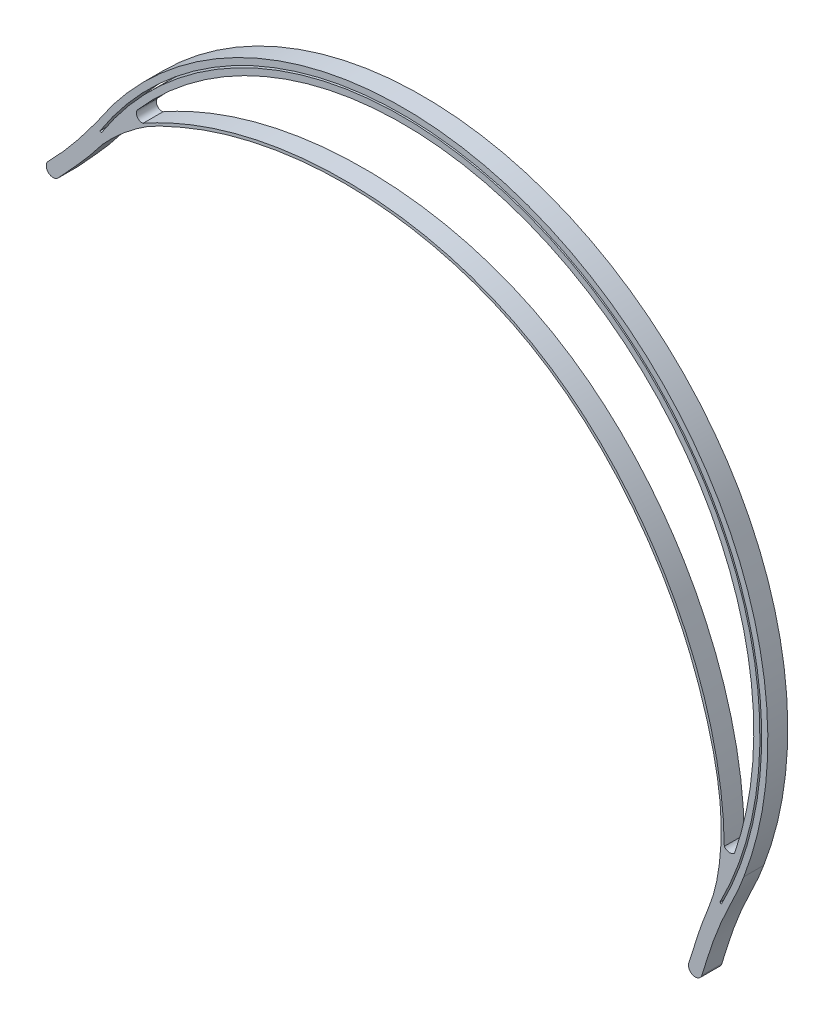
ISO-10303-21;
HEADER;
FILE_DESCRIPTION(('STEP AP214'),'2;1');
FILE_NAME('part.step','',(''),(''),'','','');
FILE_SCHEMA(('AUTOMOTIVE_DESIGN { 1 0 10303 214 1 1 1 1 }'));
ENDSEC;
DATA;
#1=APPLICATION_CONTEXT('core data for automotive mechanical design processes');
#2=APPLICATION_PROTOCOL_DEFINITION('international standard','automotive_design',2000,#1);
#3=PRODUCT_CONTEXT('',#1,'mechanical');
#4=PRODUCT('Part','Part','',(#3));
#5=PRODUCT_RELATED_PRODUCT_CATEGORY('part','',(#4));
#6=PRODUCT_DEFINITION_FORMATION('','',#4);
#7=PRODUCT_DEFINITION_CONTEXT('part definition',#1,'design');
#8=PRODUCT_DEFINITION('design','',#6,#7);
#9=PRODUCT_DEFINITION_SHAPE('','',#8);
#10=(LENGTH_UNIT() NAMED_UNIT(*) SI_UNIT(.MILLI.,.METRE.));
#11=(NAMED_UNIT(*) PLANE_ANGLE_UNIT() SI_UNIT($,.RADIAN.));
#12=(NAMED_UNIT(*) SI_UNIT($,.STERADIAN.) SOLID_ANGLE_UNIT());
#13=UNCERTAINTY_MEASURE_WITH_UNIT(LENGTH_MEASURE(1.E-05),#10,'distance_accuracy_value','');
#14=(GEOMETRIC_REPRESENTATION_CONTEXT(3) GLOBAL_UNCERTAINTY_ASSIGNED_CONTEXT((#13)) GLOBAL_UNIT_ASSIGNED_CONTEXT((#10,
#11,#12)) REPRESENTATION_CONTEXT('',''));
#15=CARTESIAN_POINT('',(0.,0.,0.));
#16=DIRECTION('',(0.,0.,1.));
#17=DIRECTION('',(1.,0.,0.));
#18=AXIS2_PLACEMENT_3D('',#15,#16,#17);
#19=CARTESIAN_POINT('',(-4.99097492053704,-8.6446468650292,5.));
#20=DIRECTION('',(-0.499998927513297,-0.86602602298404,0.));
#21=DIRECTION('',(0.86602602298404,-0.499998927513297,0.));
#22=AXIS2_PLACEMENT_3D('',#19,#20,#21);
#23=PLANE('',#22);
#24=DIRECTION('',(-0.86602602298404,0.499998927513297,0.));
#25=VECTOR('',#24,1.);
#26=CARTESIAN_POINT('',(-4.99097492053704,-8.6446468650292,0.));
#27=LINE('',#26,#25);
#28=CARTESIAN_POINT('',(78.8601791521224,-57.0559947857539,0.));
#29=VERTEX_POINT('',#28);
#30=CARTESIAN_POINT('',(78.4781658311934,-56.8354399228618,0.));
#31=VERTEX_POINT('',#30);
#32=EDGE_CURVE('E219',#29,#31,#27,.T.);
#33=ORIENTED_EDGE('',*,*,#32,.T.);
#34=DIRECTION('',(0.,0.,-1.));
#35=VECTOR('',#34,1.);
#36=CARTESIAN_POINT('',(78.4781658311934,-56.8354399228618,5.));
#37=LINE('',#36,#35);
#38=CARTESIAN_POINT('',(78.4781658311934,-56.8354399228618,5.));
#39=VERTEX_POINT('',#38);
#40=EDGE_CURVE('E11',#39,#31,#37,.T.);
#41=ORIENTED_EDGE('',*,*,#40,.F.);
#42=DIRECTION('',(-0.86602602298404,0.499998927513297,0.));
#43=VECTOR('',#42,1.);
#44=CARTESIAN_POINT('',(-4.99097492053704,-8.6446468650292,5.));
#45=LINE('',#44,#43);
#46=CARTESIAN_POINT('',(78.8601791521224,-57.0559947857539,5.));
#47=VERTEX_POINT('',#46);
#48=EDGE_CURVE('E154',#47,#39,#45,.T.);
#49=ORIENTED_EDGE('',*,*,#48,.F.);
#50=DIRECTION('',(0.,0.,-1.));
#51=VECTOR('',#50,1.);
#52=CARTESIAN_POINT('',(78.8601791521224,-57.0559947857539,5.));
#53=LINE('',#52,#51);
#54=EDGE_CURVE('E58',#47,#29,#53,.T.);
#55=ORIENTED_EDGE('',*,*,#54,.T.);
#56=EDGE_LOOP('',(#33,#41,#49,#55));
#57=FACE_BOUND('',#56,.T.);
#58=ADVANCED_FACE('F39',(#57),#23,.F.);
#59=CARTESIAN_POINT('',(-1.14920674872865,-15.590511243561,5.));
#60=DIRECTION('',(0.,0.,-1.));
#61=DIRECTION('',(-1.,0.,0.));
#62=AXIS2_PLACEMENT_3D('',#59,#60,#61);
#63=CYLINDRICAL_SURFACE('',#62,89.6753177063919);
#64=CARTESIAN_POINT('',(-1.14920674872865,-15.590511243561,0.));
#65=DIRECTION('',(0.,0.,1.));
#66=DIRECTION('',(1.,0.,0.));
#67=AXIS2_PLACEMENT_3D('',#64,#65,#66);
#68=CIRCLE('',#67,89.6753177063919);
#69=CARTESIAN_POINT('',(-76.6821687728034,32.7461648276379,0.));
#70=VERTEX_POINT('',#69);
#71=EDGE_CURVE('E160',#31,#70,#68,.T.);
#72=ORIENTED_EDGE('',*,*,#71,.T.);
#73=DIRECTION('',(0.,0.,-1.));
#74=VECTOR('',#73,1.);
#75=CARTESIAN_POINT('',(-76.6821687728034,32.7461648276379,5.));
#76=LINE('',#75,#74);
#77=CARTESIAN_POINT('',(-76.6821687728034,32.7461648276379,5.));
#78=VERTEX_POINT('',#77);
#79=EDGE_CURVE('E49',#78,#70,#76,.T.);
#80=ORIENTED_EDGE('',*,*,#79,.F.);
#81=CARTESIAN_POINT('',(-1.14920674872865,-15.590511243561,5.));
#82=DIRECTION('',(0.,0.,1.));
#83=DIRECTION('',(1.,0.,0.));
#84=AXIS2_PLACEMENT_3D('',#81,#82,#83);
#85=CIRCLE('',#84,89.6753177063919);
#86=EDGE_CURVE('E148',#39,#78,#85,.T.);
#87=ORIENTED_EDGE('',*,*,#86,.F.);
#88=ORIENTED_EDGE('',*,*,#40,.T.);
#89=EDGE_LOOP('',(#72,#80,#87,#88));
#90=FACE_BOUND('',#89,.T.);
#91=ADVANCED_FACE('F159',(#90),#63,.T.);
#92=CARTESIAN_POINT('',(-4.99097492053687,-8.64464686502881,5.));
#93=DIRECTION('',(-0.4999989275133,-0.866026022984038,0.));
#94=DIRECTION('',(0.866026022984038,-0.4999989275133,0.));
#95=AXIS2_PLACEMENT_3D('',#92,#93,#94);
#96=PLANE('',#95);
#97=DIRECTION('',(-0.866026022984038,0.4999989275133,0.));
#98=VECTOR('',#97,1.);
#99=CARTESIAN_POINT('',(-4.99097492053687,-8.64464686502881,0.));
#100=LINE('',#99,#98);
#101=CARTESIAN_POINT('',(-77.0641878157721,32.9667229941418,0.));
#102=VERTEX_POINT('',#101);
#103=EDGE_CURVE('E222',#70,#102,#100,.T.);
#104=ORIENTED_EDGE('',*,*,#103,.T.);
#105=DIRECTION('',(0.,0.,-1.));
#106=VECTOR('',#105,1.);
#107=CARTESIAN_POINT('',(-77.0641878157721,32.9667229941418,5.));
#108=LINE('',#107,#106);
#109=CARTESIAN_POINT('',(-77.0641878157721,32.9667229941418,5.));
#110=VERTEX_POINT('',#109);
#111=EDGE_CURVE('E103',#110,#102,#108,.T.);
#112=ORIENTED_EDGE('',*,*,#111,.F.);
#113=DIRECTION('',(-0.866026022984038,0.4999989275133,0.));
#114=VECTOR('',#113,1.);
#115=CARTESIAN_POINT('',(-4.99097492053687,-8.64464686502881,5.));
#116=LINE('',#115,#114);
#117=EDGE_CURVE('E153',#78,#110,#116,.T.);
#118=ORIENTED_EDGE('',*,*,#117,.F.);
#119=ORIENTED_EDGE('',*,*,#79,.T.);
#120=EDGE_LOOP('',(#104,#112,#118,#119));
#121=FACE_BOUND('',#120,.T.);
#122=ADVANCED_FACE('F164',(#121),#96,.F.);
#123=CARTESIAN_POINT('',(84.470380970849,-48.3093962380359,5.));
#124=CARTESIAN_POINT('',(83.2552546035961,-51.8113041087623,5.));
#125=CARTESIAN_POINT('',(81.0229429316491,-55.9697439452432,5.));
#126=CARTESIAN_POINT('',(78.6973689914011,-61.2071086532984,5.));
#127=CARTESIAN_POINT('',(76.4966467152328,-66.6580479513901,5.));
#128=CARTESIAN_POINT('',(75.1003199029638,-71.3229322567166,5.));
#129=CARTESIAN_POINT('',(73.9516889542474,-74.9831328103016,5.));
#130=B_SPLINE_CURVE_WITH_KNOTS('',3,(#123,#124,#125,#126,#127,#128,#129),.UNSPECIFIED.,.F.,.F.,
(4,1,1,1,4),(0.,0.385907979790343,0.492307944999733,0.59870789428743,1.),.UNSPECIFIED.);
#131=DIRECTION('',(0.,0.,-1.));
#132=VECTOR('',#131,1.);
#133=SURFACE_OF_LINEAR_EXTRUSION('',#130,#132);
#134=CARTESIAN_POINT('',(84.470380970849,-48.3093962380359,0.));
#135=CARTESIAN_POINT('',(83.2552546035961,-51.8113041087623,0.));
#136=CARTESIAN_POINT('',(81.0229429316491,-55.9697439452432,0.));
#137=CARTESIAN_POINT('',(78.6973689914011,-61.2071086532984,0.));
#138=CARTESIAN_POINT('',(76.4966467152328,-66.6580479513901,0.));
#139=CARTESIAN_POINT('',(75.1003199029638,-71.3229322567166,0.));
#140=CARTESIAN_POINT('',(73.9516889542474,-74.9831328103016,0.));
#141=B_SPLINE_CURVE_WITH_KNOTS('',3,(#134,#135,#136,#137,#138,#139,#140),.UNSPECIFIED.,.F.,.F.,
(4,1,1,1,4),(0.,0.385907979790343,0.492307944999733,0.59870789428743,1.),.UNSPECIFIED.);
#142=CARTESIAN_POINT('',(84.470380970849,-48.3093962380359,0.));
#143=VERTEX_POINT('',#142);
#144=CARTESIAN_POINT('',(73.9516889542474,-74.9831328103016,0.));
#145=VERTEX_POINT('',#144);
#146=EDGE_CURVE('E183',#143,#145,#141,.T.);
#147=ORIENTED_EDGE('',*,*,#146,.F.);
#148=DIRECTION('',(0.,0.,-1.));
#149=VECTOR('',#148,1.);
#150=CARTESIAN_POINT('',(84.470380970849,-48.3093962380359,5.));
#151=LINE('',#150,#149);
#152=CARTESIAN_POINT('',(84.470380970849,-48.3093962380359,5.));
#153=VERTEX_POINT('',#152);
#154=EDGE_CURVE('E229',#153,#143,#151,.T.);
#155=ORIENTED_EDGE('',*,*,#154,.F.);
#156=CARTESIAN_POINT('',(73.9516889542474,-74.9831328103016,5.));
#157=VERTEX_POINT('',#156);
#158=EDGE_CURVE('E272',#153,#157,#130,.T.);
#159=ORIENTED_EDGE('',*,*,#158,.T.);
#160=DIRECTION('',(0.,0.,-1.));
#161=VECTOR('',#160,1.);
#162=CARTESIAN_POINT('',(73.9516889542474,-74.9831328103016,5.));
#163=LINE('',#162,#161);
#164=EDGE_CURVE('E231',#157,#145,#163,.T.);
#165=ORIENTED_EDGE('',*,*,#164,.T.);
#166=EDGE_LOOP('',(#147,#155,#159,#165));
#167=FACE_BOUND('',#166,.T.);
#168=ADVANCED_FACE('F293',(#167),#133,.T.);
#169=CARTESIAN_POINT('',(-1.14925461566058,-15.5905783569686,5.));
#170=DIRECTION('',(0.,0.,-1.));
#171=DIRECTION('',(-1.,0.,0.));
#172=AXIS2_PLACEMENT_3D('',#169,#170,#171);
#173=CYLINDRICAL_SURFACE('',#172,91.6582949956039);
#174=CARTESIAN_POINT('',(-1.14925461566058,-15.5905783569686,0.));
#175=DIRECTION('',(0.,0.,1.));
#176=DIRECTION('',(1.,0.,0.));
#177=AXIS2_PLACEMENT_3D('',#174,#175,#176);
#178=CIRCLE('',#177,91.6582949956039);
#179=CARTESIAN_POINT('',(-73.7812135726081,40.318647890382,0.));
#180=VERTEX_POINT('',#179);
#181=EDGE_CURVE('E191',#180,#143,#178,.F.);
#182=ORIENTED_EDGE('',*,*,#181,.F.);
#183=DIRECTION('',(0.,0.,-1.));
#184=VECTOR('',#183,1.);
#185=CARTESIAN_POINT('',(-73.7812135726081,40.318647890382,5.));
#186=LINE('',#185,#184);
#187=CARTESIAN_POINT('',(-73.7812135726081,40.318647890382,5.));
#188=VERTEX_POINT('',#187);
#189=EDGE_CURVE('E241',#188,#180,#186,.T.);
#190=ORIENTED_EDGE('',*,*,#189,.F.);
#191=CARTESIAN_POINT('',(-1.14925461566058,-15.5905783569686,5.));
#192=DIRECTION('',(0.,0.,1.));
#193=DIRECTION('',(1.,0.,0.));
#194=AXIS2_PLACEMENT_3D('',#191,#192,#193);
#195=CIRCLE('',#194,91.6582949956039);
#196=EDGE_CURVE('E341',#188,#153,#195,.F.);
#197=ORIENTED_EDGE('',*,*,#196,.T.);
#198=ORIENTED_EDGE('',*,*,#154,.T.);
#199=EDGE_LOOP('',(#182,#190,#197,#198));
#200=FACE_BOUND('',#199,.T.);
#201=ADVANCED_FACE('F353',(#200),#173,.T.);
#202=CARTESIAN_POINT('',(-90.0273378401862,19.8819604208996,5.));
#203=CARTESIAN_POINT('',(-83.8742018216008,26.0716526817855,5.));
#204=CARTESIAN_POINT('',(-78.6994987845396,33.1375357703548,5.));
#205=CARTESIAN_POINT('',(-73.7812135726081,40.318647890382,5.));
#206=B_SPLINE_CURVE_WITH_KNOTS('',3,(#202,#203,#204,#205),.UNSPECIFIED.,.F.,.F.,(4,4),(0.,1.),.UNSPECIFIED.);
#207=DIRECTION('',(0.,0.,-1.));
#208=VECTOR('',#207,1.);
#209=SURFACE_OF_LINEAR_EXTRUSION('',#206,#208);
#210=CARTESIAN_POINT('',(-90.0273378401862,19.8819604208996,0.));
#211=CARTESIAN_POINT('',(-83.8742018216008,26.0716526817855,0.));
#212=CARTESIAN_POINT('',(-78.6994987845396,33.1375357703548,0.));
#213=CARTESIAN_POINT('',(-73.7812135726081,40.318647890382,0.));
#214=B_SPLINE_CURVE_WITH_KNOTS('',3,(#210,#211,#212,#213),.UNSPECIFIED.,.F.,.F.,(4,4),(0.,1.),.UNSPECIFIED.);
#215=CARTESIAN_POINT('',(-90.0273378401862,19.8819604208996,0.));
#216=VERTEX_POINT('',#215);
#217=EDGE_CURVE('E197',#216,#180,#214,.T.);
#218=ORIENTED_EDGE('',*,*,#217,.F.);
#219=DIRECTION('',(0.,0.,-1.));
#220=VECTOR('',#219,1.);
#221=CARTESIAN_POINT('',(-90.0273378401862,19.8819604208996,5.));
#222=LINE('',#221,#220);
#223=CARTESIAN_POINT('',(-90.0273378401862,19.8819604208996,5.));
#224=VERTEX_POINT('',#223);
#225=EDGE_CURVE('E239',#224,#216,#222,.T.);
#226=ORIENTED_EDGE('',*,*,#225,.F.);
#227=EDGE_CURVE('E342',#224,#188,#206,.T.);
#228=ORIENTED_EDGE('',*,*,#227,.T.);
#229=ORIENTED_EDGE('',*,*,#189,.T.);
#230=EDGE_LOOP('',(#218,#226,#228,#229));
#231=FACE_BOUND('',#230,.T.);
#232=ADVANCED_FACE('F351',(#231),#209,.T.);
#233=CARTESIAN_POINT('',(-88.788015398091,18.6878051241819,5.));
#234=DIRECTION('',(0.,0.,-1.));
#235=DIRECTION('',(-1.,0.,0.));
#236=AXIS2_PLACEMENT_3D('',#233,#234,#235);
#237=CYLINDRICAL_SURFACE('',#236,1.72102498185231);
#238=CARTESIAN_POINT('',(-88.788015398091,18.6878051241819,0.));
#239=DIRECTION('',(0.,0.,1.));
#240=DIRECTION('',(1.,0.,0.));
#241=AXIS2_PLACEMENT_3D('',#238,#239,#240);
#242=CIRCLE('',#241,1.72102498185231);
#243=CARTESIAN_POINT('',(-87.5038774520026,17.5419793417981,0.));
#244=VERTEX_POINT('',#243);
#245=EDGE_CURVE('E202',#216,#244,#242,.T.);
#246=ORIENTED_EDGE('',*,*,#245,.T.);
#247=DIRECTION('',(0.,0.,-1.));
#248=VECTOR('',#247,1.);
#249=CARTESIAN_POINT('',(-87.5038774520026,17.5419793417981,5.));
#250=LINE('',#249,#248);
#251=CARTESIAN_POINT('',(-87.5038774520026,17.5419793417981,5.));
#252=VERTEX_POINT('',#251);
#253=EDGE_CURVE('E236',#252,#244,#250,.T.);
#254=ORIENTED_EDGE('',*,*,#253,.F.);
#255=CARTESIAN_POINT('',(-88.788015398091,18.6878051241819,5.));
#256=DIRECTION('',(0.,0.,1.));
#257=DIRECTION('',(1.,0.,0.));
#258=AXIS2_PLACEMENT_3D('',#255,#256,#257);
#259=CIRCLE('',#258,1.72102498185231);
#260=EDGE_CURVE('E326',#224,#252,#259,.T.);
#261=ORIENTED_EDGE('',*,*,#260,.F.);
#262=ORIENTED_EDGE('',*,*,#225,.T.);
#263=EDGE_LOOP('',(#246,#254,#261,#262));
#264=FACE_BOUND('',#263,.T.);
#265=ADVANCED_FACE('F315',(#264),#237,.T.);
#266=CARTESIAN_POINT('',(-87.5038774520026,17.5419793417981,5.));
#267=CARTESIAN_POINT('',(-84.7078487446196,20.7631745925941,5.));
#268=CARTESIAN_POINT('',(-80.8758086646114,24.457673030869,5.));
#269=CARTESIAN_POINT('',(-77.1008950641857,29.6772682286198,5.));
#270=CARTESIAN_POINT('',(-74.8397041571171,32.0872339746294,5.));
#271=CARTESIAN_POINT('',(-71.8514774202206,34.9868372349315,5.));
#272=CARTESIAN_POINT('',(-68.7140370909234,37.4902464799857,5.));
#273=CARTESIAN_POINT('',(-64.2237737215223,40.5975026659837,5.));
#274=CARTESIAN_POINT('',(-59.4524690337061,42.7685270581112,5.));
#275=CARTESIAN_POINT('',(-54.3128107529661,44.9878522014864,5.));
#276=CARTESIAN_POINT('',(-50.1624961243849,46.516837470786,5.));
#277=CARTESIAN_POINT('',(-41.7029994654402,49.2629837777908,5.));
#278=CARTESIAN_POINT('',(-25.317880849653,52.6557396300482,5.));
#279=CARTESIAN_POINT('',(1.3283888445134,52.4670499679694,5.));
#280=CARTESIAN_POINT('',(24.5036575942992,44.9620904865953,5.));
#281=CARTESIAN_POINT('',(38.3061931032336,35.8477682537699,5.));
#282=CARTESIAN_POINT('',(43.8457075207023,31.4000087878044,5.));
#283=CARTESIAN_POINT('',(52.1628417854336,23.8318676262548,5.));
#284=CARTESIAN_POINT('',(61.1231590101108,12.7993485745438,5.));
#285=CARTESIAN_POINT('',(68.2151807939505,-0.070098063249034,5.));
#286=CARTESIAN_POINT('',(71.8277149215599,-8.4933879606281,5.));
#287=CARTESIAN_POINT('',(76.3358591000039,-21.2811133786917,5.));
#288=CARTESIAN_POINT('',(79.6903354877816,-35.931509139726,5.));
#289=CARTESIAN_POINT('',(78.3721947582463,-49.3266208645647,5.));
#290=CARTESIAN_POINT('',(76.7989497319697,-56.9961685749972,5.));
#291=CARTESIAN_POINT('',(73.6949869113807,-63.6636540268488,5.));
#292=CARTESIAN_POINT('',(71.81639534465,-70.5198472687795,5.));
#293=CARTESIAN_POINT('',(70.7216932267084,-73.8095946022937,5.));
#294=B_SPLINE_CURVE_WITH_KNOTS('',3,(#266,#267,#268,#269,#270,#271,#272,#273,#274,#275,#276,
#277,#278,#279,#280,#281,#282,#283,#284,#285,#286,#287,#288,#289,#290,#291,#292,#293),
.UNSPECIFIED.,.F.,.F.,(4,1,1,1,1,1,1,1,1,1,1,1,1,1,1,1,1,1,1,1,1,1,1,1,1,4),(0.,
0.0484308870774211,0.0597537429242613,0.0727992879006774,0.0857538550530043,0.106855975065943,
0.118128731304399,0.147466191614345,0.165856098739658,0.181527106174369,0.197480849392347,
0.266491432723666,0.369825055094409,0.496073426592658,0.534748740867662,0.556587860995895,
0.57639806852294,0.661959758323074,0.715660729407515,0.742301895763143,0.765537710705522,
0.869286349713583,0.908165754499293,0.91699872472051,0.957616051925761,1.),.UNSPECIFIED.);
#295=DIRECTION('',(0.,0.,-1.));
#296=VECTOR('',#295,1.);
#297=SURFACE_OF_LINEAR_EXTRUSION('',#294,#296);
#298=CARTESIAN_POINT('',(-87.5038774520026,17.5419793417981,0.));
#299=CARTESIAN_POINT('',(-84.7078487446196,20.7631745925941,0.));
#300=CARTESIAN_POINT('',(-80.8758086646114,24.457673030869,0.));
#301=CARTESIAN_POINT('',(-77.1008950641857,29.6772682286198,0.));
#302=CARTESIAN_POINT('',(-74.8397041571171,32.0872339746294,0.));
#303=CARTESIAN_POINT('',(-71.8514774202206,34.9868372349315,0.));
#304=CARTESIAN_POINT('',(-68.7140370909234,37.4902464799857,0.));
#305=CARTESIAN_POINT('',(-64.2237737215223,40.5975026659837,0.));
#306=CARTESIAN_POINT('',(-59.4524690337061,42.7685270581112,0.));
#307=CARTESIAN_POINT('',(-54.3128107529661,44.9878522014864,0.));
#308=CARTESIAN_POINT('',(-50.1624961243849,46.516837470786,0.));
#309=CARTESIAN_POINT('',(-41.7029994654402,49.2629837777908,0.));
#310=CARTESIAN_POINT('',(-25.317880849653,52.6557396300482,0.));
#311=CARTESIAN_POINT('',(1.3283888445134,52.4670499679694,0.));
#312=CARTESIAN_POINT('',(24.5036575942992,44.9620904865953,0.));
#313=CARTESIAN_POINT('',(38.3061931032336,35.8477682537699,0.));
#314=CARTESIAN_POINT('',(43.8457075207023,31.4000087878044,0.));
#315=CARTESIAN_POINT('',(52.1628417854336,23.8318676262548,0.));
#316=CARTESIAN_POINT('',(61.1231590101108,12.7993485745438,0.));
#317=CARTESIAN_POINT('',(68.2151807939505,-0.070098063249034,0.));
#318=CARTESIAN_POINT('',(71.8277149215599,-8.4933879606281,0.));
#319=CARTESIAN_POINT('',(76.3358591000039,-21.2811133786917,0.));
#320=CARTESIAN_POINT('',(79.6903354877816,-35.931509139726,0.));
#321=CARTESIAN_POINT('',(78.3721947582463,-49.3266208645647,0.));
#322=CARTESIAN_POINT('',(76.7989497319697,-56.9961685749972,0.));
#323=CARTESIAN_POINT('',(73.6949869113807,-63.6636540268488,0.));
#324=CARTESIAN_POINT('',(71.81639534465,-70.5198472687795,0.));
#325=CARTESIAN_POINT('',(70.7216932267084,-73.8095946022937,0.));
#326=B_SPLINE_CURVE_WITH_KNOTS('',3,(#298,#299,#300,#301,#302,#303,#304,#305,#306,#307,#308,
#309,#310,#311,#312,#313,#314,#315,#316,#317,#318,#319,#320,#321,#322,#323,#324,#325),
.UNSPECIFIED.,.F.,.F.,(4,1,1,1,1,1,1,1,1,1,1,1,1,1,1,1,1,1,1,1,1,1,1,1,1,4),(0.,
0.0484308870774211,0.0597537429242613,0.0727992879006774,0.0857538550530043,0.106855975065943,
0.118128731304399,0.147466191614345,0.165856098739658,0.181527106174369,0.197480849392347,
0.266491432723666,0.369825055094409,0.496073426592658,0.534748740867662,0.556587860995895,
0.57639806852294,0.661959758323074,0.715660729407515,0.742301895763143,0.765537710705522,
0.869286349713583,0.908165754499293,0.91699872472051,0.957616051925761,1.),.UNSPECIFIED.);
#327=CARTESIAN_POINT('',(70.7216932267084,-73.8095946022937,0.));
#328=VERTEX_POINT('',#327);
#329=EDGE_CURVE('E208',#244,#328,#326,.T.);
#330=ORIENTED_EDGE('',*,*,#329,.T.);
#331=DIRECTION('',(0.,0.,-1.));
#332=VECTOR('',#331,1.);
#333=CARTESIAN_POINT('',(70.7216932267084,-73.8095946022937,5.));
#334=LINE('',#333,#332);
#335=CARTESIAN_POINT('',(70.7216932267084,-73.8095946022937,5.));
#336=VERTEX_POINT('',#335);
#337=EDGE_CURVE('E233',#336,#328,#334,.T.);
#338=ORIENTED_EDGE('',*,*,#337,.F.);
#339=EDGE_CURVE('E318',#252,#336,#294,.T.);
#340=ORIENTED_EDGE('',*,*,#339,.F.);
#341=ORIENTED_EDGE('',*,*,#253,.T.);
#342=EDGE_LOOP('',(#330,#338,#340,#341));
#343=FACE_BOUND('',#342,.T.);
#344=ADVANCED_FACE('F300',(#343),#297,.F.);
#345=CARTESIAN_POINT('',(-66.4990298187992,41.4329397364054,5.));
#346=DIRECTION('',(0.,0.,-1.));
#347=DIRECTION('',(-1.,0.,0.));
#348=AXIS2_PLACEMENT_3D('',#345,#346,#347);
#349=CYLINDRICAL_SURFACE('',#348,1.40385106803623);
#350=CARTESIAN_POINT('',(-66.4990298187992,41.4329397364054,0.));
#351=DIRECTION('',(0.,0.,1.));
#352=DIRECTION('',(1.,0.,0.));
#353=AXIS2_PLACEMENT_3D('',#350,#351,#352);
#354=CIRCLE('',#353,1.40385106803623);
#355=CARTESIAN_POINT('',(-67.5066769173194,42.4104084806977,0.));
#356=VERTEX_POINT('',#355);
#357=CARTESIAN_POINT('',(-66.2242143660651,40.0562501242688,0.));
#358=VERTEX_POINT('',#357);
#359=EDGE_CURVE('E171',#356,#358,#354,.T.);
#360=ORIENTED_EDGE('',*,*,#359,.F.);
#361=DIRECTION('',(0.,0.,-1.));
#362=VECTOR('',#361,1.);
#363=CARTESIAN_POINT('',(-67.5066769173194,42.4104084806977,5.));
#364=LINE('',#363,#362);
#365=CARTESIAN_POINT('',(-67.5066769173194,42.4104084806977,5.));
#366=VERTEX_POINT('',#365);
#367=EDGE_CURVE('E43',#366,#356,#364,.T.);
#368=ORIENTED_EDGE('',*,*,#367,.F.);
#369=CARTESIAN_POINT('',(-66.4990298187992,41.4329397364054,5.));
#370=DIRECTION('',(0.,0.,1.));
#371=DIRECTION('',(1.,0.,0.));
#372=AXIS2_PLACEMENT_3D('',#369,#370,#371);
#373=CIRCLE('',#372,1.40385106803623);
#374=CARTESIAN_POINT('',(-66.2242143660651,40.0562501242688,5.));
#375=VERTEX_POINT('',#374);
#376=EDGE_CURVE('E227',#366,#375,#373,.T.);
#377=ORIENTED_EDGE('',*,*,#376,.T.);
#378=DIRECTION('',(0.,0.,-1.));
#379=VECTOR('',#378,1.);
#380=CARTESIAN_POINT('',(-66.2242143660651,40.0562501242688,5.));
#381=LINE('',#380,#379);
#382=EDGE_CURVE('E167',#375,#358,#381,.T.);
#383=ORIENTED_EDGE('',*,*,#382,.T.);
#384=EDGE_LOOP('',(#360,#368,#377,#383));
#385=FACE_BOUND('',#384,.T.);
#386=ADVANCED_FACE('F41',(#385),#349,.F.);
#387=CARTESIAN_POINT('',(-1.14926441544827,-15.5905978246902,5.));
#388=DIRECTION('',(0.,0.,-1.));
#389=DIRECTION('',(-1.,0.,0.));
#390=AXIS2_PLACEMENT_3D('',#387,#388,#389);
#391=CYLINDRICAL_SURFACE('',#390,88.1329843269881);
#392=CARTESIAN_POINT('',(-1.14926441544827,-15.5905978246902,0.));
#393=DIRECTION('',(0.,0.,1.));
#394=DIRECTION('',(1.,0.,0.));
#395=AXIS2_PLACEMENT_3D('',#392,#393,#394);
#396=CIRCLE('',#395,88.1329843269881);
#397=CARTESIAN_POINT('',(82.1679975479974,-44.3248419472644,0.));
#398=VERTEX_POINT('',#397);
#399=EDGE_CURVE('E174',#356,#398,#396,.F.);
#400=ORIENTED_EDGE('',*,*,#399,.T.);
#401=DIRECTION('',(0.,0.,-1.));
#402=VECTOR('',#401,1.);
#403=CARTESIAN_POINT('',(82.1679975479974,-44.3248419472644,5.));
#404=LINE('',#403,#402);
#405=CARTESIAN_POINT('',(82.1679975479974,-44.3248419472644,5.));
#406=VERTEX_POINT('',#405);
#407=EDGE_CURVE('E247',#406,#398,#404,.T.);
#408=ORIENTED_EDGE('',*,*,#407,.F.);
#409=CARTESIAN_POINT('',(-1.14926441544827,-15.5905978246902,5.));
#410=DIRECTION('',(0.,0.,1.));
#411=DIRECTION('',(1.,0.,0.));
#412=AXIS2_PLACEMENT_3D('',#409,#410,#411);
#413=CIRCLE('',#412,88.1329843269881);
#414=EDGE_CURVE('E256',#366,#406,#413,.F.);
#415=ORIENTED_EDGE('',*,*,#414,.F.);
#416=ORIENTED_EDGE('',*,*,#367,.T.);
#417=EDGE_LOOP('',(#400,#408,#415,#416));
#418=FACE_BOUND('',#417,.T.);
#419=ADVANCED_FACE('F255',(#418),#391,.F.);
#420=CARTESIAN_POINT('',(80.9580428165796,-43.1517349576873,5.));
#421=DIRECTION('',(0.,0.,-1.));
#422=DIRECTION('',(-1.,0.,0.));
#423=AXIS2_PLACEMENT_3D('',#420,#421,#422);
#424=CYLINDRICAL_SURFACE('',#423,1.6852805288957);
#425=CARTESIAN_POINT('',(80.9580428165796,-43.1517349576873,0.));
#426=DIRECTION('',(0.,0.,1.));
#427=DIRECTION('',(1.,0.,0.));
#428=AXIS2_PLACEMENT_3D('',#425,#426,#427);
#429=CIRCLE('',#428,1.6852805288957);
#430=CARTESIAN_POINT('',(79.5874616593255,-44.1323866555164,0.));
#431=VERTEX_POINT('',#430);
#432=EDGE_CURVE('E176',#398,#431,#429,.F.);
#433=ORIENTED_EDGE('',*,*,#432,.T.);
#434=DIRECTION('',(0.,0.,-1.));
#435=VECTOR('',#434,1.);
#436=CARTESIAN_POINT('',(79.5874616593255,-44.1323866555164,5.));
#437=LINE('',#436,#435);
#438=CARTESIAN_POINT('',(79.5874616593255,-44.1323866555164,5.));
#439=VERTEX_POINT('',#438);
#440=EDGE_CURVE('E245',#439,#431,#437,.T.);
#441=ORIENTED_EDGE('',*,*,#440,.F.);
#442=CARTESIAN_POINT('',(80.9580428165796,-43.1517349576873,5.));
#443=DIRECTION('',(0.,0.,1.));
#444=DIRECTION('',(1.,0.,0.));
#445=AXIS2_PLACEMENT_3D('',#442,#443,#444);
#446=CIRCLE('',#445,1.6852805288957);
#447=EDGE_CURVE('E269',#406,#439,#446,.F.);
#448=ORIENTED_EDGE('',*,*,#447,.F.);
#449=ORIENTED_EDGE('',*,*,#407,.T.);
#450=EDGE_LOOP('',(#433,#441,#448,#449));
#451=FACE_BOUND('',#450,.T.);
#452=ADVANCED_FACE('F268',(#451),#424,.F.);
#453=CARTESIAN_POINT('',(72.319366080765,-74.4440483125342,5.));
#454=DIRECTION('',(0.,0.,-1.));
#455=DIRECTION('',(-1.,0.,0.));
#456=AXIS2_PLACEMENT_3D('',#453,#454,#455);
#457=CYLINDRICAL_SURFACE('',#456,1.71903753857418);
#458=CARTESIAN_POINT('',(72.319366080765,-74.4440483125342,0.));
#459=DIRECTION('',(0.,0.,1.));
#460=DIRECTION('',(1.,0.,0.));
#461=AXIS2_PLACEMENT_3D('',#458,#459,#460);
#462=CIRCLE('',#461,1.71903753857418);
#463=EDGE_CURVE('E213',#328,#145,#462,.T.);
#464=ORIENTED_EDGE('',*,*,#463,.T.);
#465=ORIENTED_EDGE('',*,*,#164,.F.);
#466=CARTESIAN_POINT('',(72.319366080765,-74.4440483125342,5.));
#467=DIRECTION('',(0.,0.,1.));
#468=DIRECTION('',(1.,0.,0.));
#469=AXIS2_PLACEMENT_3D('',#466,#467,#468);
#470=CIRCLE('',#469,1.71903753857418);
#471=EDGE_CURVE('E325',#336,#157,#470,.T.);
#472=ORIENTED_EDGE('',*,*,#471,.F.);
#473=ORIENTED_EDGE('',*,*,#337,.T.);
#474=EDGE_LOOP('',(#464,#465,#472,#473));
#475=FACE_BOUND('',#474,.T.);
#476=ADVANCED_FACE('F292',(#475),#457,.T.);
#477=CARTESIAN_POINT('',(79.5874616593255,-44.1323866555164,5.));
#478=CARTESIAN_POINT('',(79.5355465198956,-39.8907315951978,5.));
#479=CARTESIAN_POINT('',(78.8521556641347,-31.4074854684837,5.));
#480=CARTESIAN_POINT('',(75.7103611982971,-16.444096656001,5.));
#481=CARTESIAN_POINT('',(70.0854994984171,-1.67987575558445,5.));
#482=CARTESIAN_POINT('',(58.7333812750139,17.9957224244694,5.));
#483=CARTESIAN_POINT('',(43.033146222612,34.7996495891358,5.));
#484=CARTESIAN_POINT('',(18.0867654190991,48.5558111031179,5.));
#485=CARTESIAN_POINT('',(-13.7843734640592,55.3598723056783,5.));
#486=CARTESIAN_POINT('',(-44.5589433383837,50.5921221510632,5.));
#487=CARTESIAN_POINT('',(-62.2828618670322,42.2686754498815,5.));
#488=CARTESIAN_POINT('',(-66.2242143660651,40.0562501242688,5.));
#489=B_SPLINE_CURVE_WITH_KNOTS('',3,(#477,#478,#479,#480,#481,#482,#483,#484,#485,#486,#487,
#488),.UNSPECIFIED.,.F.,.F.,(4,1,1,1,1,1,1,1,1,4),(0.,0.0626287534866362,0.125355314070845,
0.225241680877906,0.294214160579851,0.460411112029248,0.556083705954376,0.711354993474961,
0.933276474541961,1.),.UNSPECIFIED.);
#490=DIRECTION('',(0.,0.,-1.));
#491=VECTOR('',#490,1.);
#492=SURFACE_OF_LINEAR_EXTRUSION('',#489,#491);
#493=CARTESIAN_POINT('',(79.5874616593255,-44.1323866555164,0.));
#494=CARTESIAN_POINT('',(79.5355465198956,-39.8907315951978,0.));
#495=CARTESIAN_POINT('',(78.8521556641347,-31.4074854684837,0.));
#496=CARTESIAN_POINT('',(75.7103611982971,-16.444096656001,0.));
#497=CARTESIAN_POINT('',(70.0854994984171,-1.67987575558445,0.));
#498=CARTESIAN_POINT('',(58.7333812750139,17.9957224244694,0.));
#499=CARTESIAN_POINT('',(43.033146222612,34.7996495891358,0.));
#500=CARTESIAN_POINT('',(18.0867654190991,48.5558111031179,0.));
#501=CARTESIAN_POINT('',(-13.7843734640592,55.3598723056783,0.));
#502=CARTESIAN_POINT('',(-44.5589433383837,50.5921221510632,0.));
#503=CARTESIAN_POINT('',(-62.2828618670322,42.2686754498815,0.));
#504=CARTESIAN_POINT('',(-66.2242143660651,40.0562501242688,0.));
#505=B_SPLINE_CURVE_WITH_KNOTS('',3,(#493,#494,#495,#496,#497,#498,#499,#500,#501,#502,#503,
#504),.UNSPECIFIED.,.F.,.F.,(4,1,1,1,1,1,1,1,1,4),(0.,0.0626287534866362,0.125355314070845,
0.225241680877906,0.294214160579851,0.460411112029248,0.556083705954376,0.711354993474961,
0.933276474541961,1.),.UNSPECIFIED.);
#506=EDGE_CURVE('E178',#431,#358,#505,.T.);
#507=ORIENTED_EDGE('',*,*,#506,.T.);
#508=ORIENTED_EDGE('',*,*,#382,.F.);
#509=EDGE_CURVE('E267',#439,#375,#489,.T.);
#510=ORIENTED_EDGE('',*,*,#509,.F.);
#511=ORIENTED_EDGE('',*,*,#440,.T.);
#512=EDGE_LOOP('',(#507,#508,#510,#511));
#513=FACE_BOUND('',#512,.T.);
#514=ADVANCED_FACE('F265',(#513),#492,.F.);
#515=CARTESIAN_POINT('',(-1.14920076285012,-15.5904942684337,5.));
#516=DIRECTION('',(0.,0.,-1.));
#517=DIRECTION('',(-1.,0.,0.));
#518=AXIS2_PLACEMENT_3D('',#515,#516,#517);
#519=CYLINDRICAL_SURFACE('',#518,90.1159730987258);
#520=CARTESIAN_POINT('',(-1.14920076285012,-15.5904942684337,0.));
#521=DIRECTION('',(0.,0.,1.));
#522=DIRECTION('',(1.,0.,0.));
#523=AXIS2_PLACEMENT_3D('',#520,#521,#522);
#524=CIRCLE('',#523,90.1159730987258);
#525=EDGE_CURVE('E224',#29,#102,#524,.T.);
#526=ORIENTED_EDGE('',*,*,#525,.F.);
#527=ORIENTED_EDGE('',*,*,#54,.F.);
#528=CARTESIAN_POINT('',(-1.14920076285012,-15.5904942684337,5.));
#529=DIRECTION('',(0.,0.,1.));
#530=DIRECTION('',(1.,0.,0.));
#531=AXIS2_PLACEMENT_3D('',#528,#529,#530);
#532=CIRCLE('',#531,90.1159730987258);
#533=EDGE_CURVE('E165',#47,#110,#532,.T.);
#534=ORIENTED_EDGE('',*,*,#533,.T.);
#535=ORIENTED_EDGE('',*,*,#111,.T.);
#536=EDGE_LOOP('',(#526,#527,#534,#535));
#537=FACE_BOUND('',#536,.T.);
#538=ADVANCED_FACE('F291',(#537),#519,.F.);
#539=CARTESIAN_POINT('',(0.,0.,5.));
#540=DIRECTION('',(0.,0.,1.));
#541=DIRECTION('',(1.,0.,0.));
#542=AXIS2_PLACEMENT_3D('',#539,#540,#541);
#543=PLANE('',#542);
#544=ORIENTED_EDGE('',*,*,#376,.F.);
#545=ORIENTED_EDGE('',*,*,#414,.T.);
#546=ORIENTED_EDGE('',*,*,#447,.T.);
#547=ORIENTED_EDGE('',*,*,#509,.T.);
#548=EDGE_LOOP('',(#544,#545,#546,#547));
#549=FACE_BOUND('',#548,.T.);
#550=ORIENTED_EDGE('',*,*,#158,.F.);
#551=ORIENTED_EDGE('',*,*,#196,.F.);
#552=ORIENTED_EDGE('',*,*,#227,.F.);
#553=ORIENTED_EDGE('',*,*,#260,.T.);
#554=ORIENTED_EDGE('',*,*,#339,.T.);
#555=ORIENTED_EDGE('',*,*,#471,.T.);
#556=EDGE_LOOP('',(#550,#551,#552,#553,#554,#555));
#557=FACE_BOUND('',#556,.T.);
#558=ORIENTED_EDGE('',*,*,#48,.T.);
#559=ORIENTED_EDGE('',*,*,#86,.T.);
#560=ORIENTED_EDGE('',*,*,#117,.T.);
#561=ORIENTED_EDGE('',*,*,#533,.F.);
#562=EDGE_LOOP('',(#558,#559,#560,#561));
#563=FACE_BOUND('',#562,.T.);
#564=ADVANCED_FACE('F150',(#549,#557,#563),#543,.T.);
#565=CARTESIAN_POINT('',(0.,0.,0.));
#566=DIRECTION('',(0.,0.,1.));
#567=DIRECTION('',(1.,0.,0.));
#568=AXIS2_PLACEMENT_3D('',#565,#566,#567);
#569=PLANE('',#568);
#570=ORIENTED_EDGE('',*,*,#359,.T.);
#571=ORIENTED_EDGE('',*,*,#506,.F.);
#572=ORIENTED_EDGE('',*,*,#432,.F.);
#573=ORIENTED_EDGE('',*,*,#399,.F.);
#574=EDGE_LOOP('',(#570,#571,#572,#573));
#575=FACE_BOUND('',#574,.T.);
#576=ORIENTED_EDGE('',*,*,#146,.T.);
#577=ORIENTED_EDGE('',*,*,#463,.F.);
#578=ORIENTED_EDGE('',*,*,#329,.F.);
#579=ORIENTED_EDGE('',*,*,#245,.F.);
#580=ORIENTED_EDGE('',*,*,#217,.T.);
#581=ORIENTED_EDGE('',*,*,#181,.T.);
#582=EDGE_LOOP('',(#576,#577,#578,#579,#580,#581));
#583=FACE_BOUND('',#582,.T.);
#584=ORIENTED_EDGE('',*,*,#32,.F.);
#585=ORIENTED_EDGE('',*,*,#525,.T.);
#586=ORIENTED_EDGE('',*,*,#103,.F.);
#587=ORIENTED_EDGE('',*,*,#71,.F.);
#588=EDGE_LOOP('',(#584,#585,#586,#587));
#589=FACE_BOUND('',#588,.T.);
#590=ADVANCED_FACE('F259',(#575,#583,#589),#569,.F.);
#591=CLOSED_SHELL('',(#58,#91,#122,#168,#201,#232,#265,#344,#386,#419,#452,#476,#514,#538,#564,#590));
#592=MANIFOLD_SOLID_BREP('B2',#591);
#593=ADVANCED_BREP_SHAPE_REPRESENTATION('',(#18,#592),#14);
#594=SHAPE_DEFINITION_REPRESENTATION(#9,#593);
ENDSEC;
END-ISO-10303-21;
